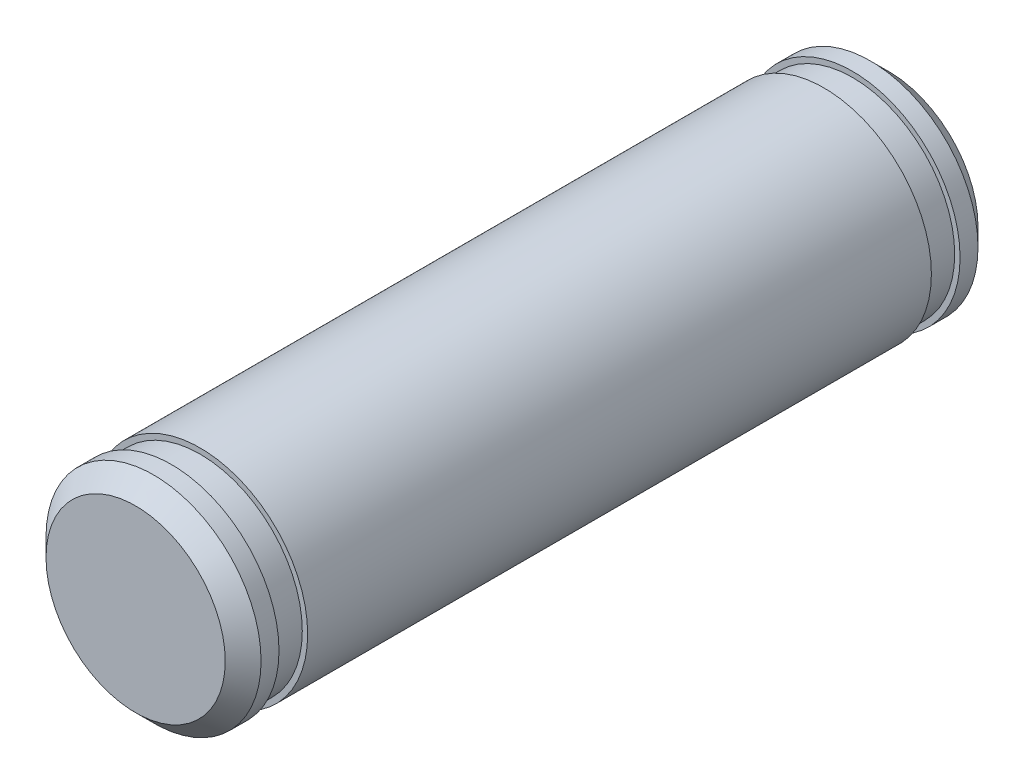
ISO-10303-21;
HEADER;
FILE_DESCRIPTION(('STEP AP214'),'2;1');
FILE_NAME('part.step','',(''),(''),'','','');
FILE_SCHEMA(('AUTOMOTIVE_DESIGN { 1 0 10303 214 1 1 1 1 }'));
ENDSEC;
DATA;
#1=APPLICATION_CONTEXT('core data for automotive mechanical design processes');
#2=APPLICATION_PROTOCOL_DEFINITION('international standard','automotive_design',2000,#1);
#3=PRODUCT_CONTEXT('',#1,'mechanical');
#4=PRODUCT('Part','Part','',(#3));
#5=PRODUCT_RELATED_PRODUCT_CATEGORY('part','',(#4));
#6=PRODUCT_DEFINITION_FORMATION('','',#4);
#7=PRODUCT_DEFINITION_CONTEXT('part definition',#1,'design');
#8=PRODUCT_DEFINITION('design','',#6,#7);
#9=PRODUCT_DEFINITION_SHAPE('','',#8);
#10=(LENGTH_UNIT() NAMED_UNIT(*) SI_UNIT(.MILLI.,.METRE.));
#11=(NAMED_UNIT(*) PLANE_ANGLE_UNIT() SI_UNIT($,.RADIAN.));
#12=(NAMED_UNIT(*) SI_UNIT($,.STERADIAN.) SOLID_ANGLE_UNIT());
#13=UNCERTAINTY_MEASURE_WITH_UNIT(LENGTH_MEASURE(1.E-05),#10,'distance_accuracy_value','');
#14=(GEOMETRIC_REPRESENTATION_CONTEXT(3) GLOBAL_UNCERTAINTY_ASSIGNED_CONTEXT((#13)) GLOBAL_UNIT_ASSIGNED_CONTEXT((#10,
#11,#12)) REPRESENTATION_CONTEXT('',''));
#15=CARTESIAN_POINT('',(0.,0.,0.));
#16=DIRECTION('',(0.,0.,1.));
#17=DIRECTION('',(1.,0.,0.));
#18=AXIS2_PLACEMENT_3D('',#15,#16,#17);
#19=CARTESIAN_POINT('',(0.,0.,21.));
#20=DIRECTION('',(0.,0.,-1.));
#21=DIRECTION('',(-1.,0.,0.));
#22=AXIS2_PLACEMENT_3D('',#19,#20,#21);
#23=CYLINDRICAL_SURFACE('',#22,3.);
#24=CARTESIAN_POINT('',(0.,0.,19.2));
#25=DIRECTION('',(0.,0.,1.));
#26=DIRECTION('',(1.,0.,0.));
#27=AXIS2_PLACEMENT_3D('',#24,#25,#26);
#28=CIRCLE('',#27,3.);
#29=CARTESIAN_POINT('',(-3.,0.,19.2));
#30=VERTEX_POINT('',#29);
#31=EDGE_CURVE('E68',#30,#30,#28,.T.);
#32=CARTESIAN_POINT('',(0.,0.,1.8));
#33=DIRECTION('',(0.,0.,-1.));
#34=DIRECTION('',(-1.,0.,0.));
#35=AXIS2_PLACEMENT_3D('',#32,#33,#34);
#36=CIRCLE('',#35,3.);
#37=CARTESIAN_POINT('',(-3.,0.,1.8));
#38=VERTEX_POINT('',#37);
#39=EDGE_CURVE('E81',#38,#38,#36,.T.);
#40=CARTESIAN_POINT('',(-3.,0.,19.2));
#41=CARTESIAN_POINT('',(-3.,0.,19.01875));
#42=CARTESIAN_POINT('',(-3.,0.,18.8375));
#43=CARTESIAN_POINT('',(-3.,0.,18.475));
#44=CARTESIAN_POINT('',(-3.,0.,18.29375));
#45=CARTESIAN_POINT('',(-3.,0.,17.93125));
#46=CARTESIAN_POINT('',(-3.,0.,17.75));
#47=CARTESIAN_POINT('',(-3.,0.,17.3875));
#48=CARTESIAN_POINT('',(-3.,0.,17.20625));
#49=CARTESIAN_POINT('',(-3.,0.,16.84375));
#50=CARTESIAN_POINT('',(-3.,0.,16.6625));
#51=CARTESIAN_POINT('',(-3.,0.,16.3));
#52=CARTESIAN_POINT('',(-3.,0.,16.11875));
#53=CARTESIAN_POINT('',(-3.,0.,15.75625));
#54=CARTESIAN_POINT('',(-3.,0.,15.575));
#55=CARTESIAN_POINT('',(-3.,0.,15.2125));
#56=CARTESIAN_POINT('',(-3.,0.,15.03125));
#57=CARTESIAN_POINT('',(-3.,0.,14.66875));
#58=CARTESIAN_POINT('',(-3.,0.,14.4875));
#59=CARTESIAN_POINT('',(-3.,0.,14.125));
#60=CARTESIAN_POINT('',(-3.,0.,13.94375));
#61=CARTESIAN_POINT('',(-3.,0.,13.58125));
#62=CARTESIAN_POINT('',(-3.,0.,13.4));
#63=CARTESIAN_POINT('',(-3.,0.,13.0375));
#64=CARTESIAN_POINT('',(-3.,0.,12.85625));
#65=CARTESIAN_POINT('',(-3.,0.,12.49375));
#66=CARTESIAN_POINT('',(-3.,0.,12.3125));
#67=CARTESIAN_POINT('',(-3.,0.,11.95));
#68=CARTESIAN_POINT('',(-3.,0.,11.76875));
#69=CARTESIAN_POINT('',(-3.,0.,11.40625));
#70=CARTESIAN_POINT('',(-3.,0.,11.225));
#71=CARTESIAN_POINT('',(-3.,0.,10.8625));
#72=CARTESIAN_POINT('',(-3.,0.,10.68125));
#73=CARTESIAN_POINT('',(-3.,0.,10.31875));
#74=CARTESIAN_POINT('',(-3.,0.,10.1375));
#75=CARTESIAN_POINT('',(-3.,0.,9.775));
#76=CARTESIAN_POINT('',(-3.,0.,9.59375));
#77=CARTESIAN_POINT('',(-3.,0.,9.23125));
#78=CARTESIAN_POINT('',(-3.,0.,9.05));
#79=CARTESIAN_POINT('',(-3.,0.,8.6875));
#80=CARTESIAN_POINT('',(-3.,0.,8.50625));
#81=CARTESIAN_POINT('',(-3.,0.,8.14375));
#82=CARTESIAN_POINT('',(-3.,0.,7.9625));
#83=CARTESIAN_POINT('',(-3.,0.,7.6));
#84=CARTESIAN_POINT('',(-3.,0.,7.41875));
#85=CARTESIAN_POINT('',(-3.,0.,7.05625));
#86=CARTESIAN_POINT('',(-3.,0.,6.875));
#87=CARTESIAN_POINT('',(-3.,0.,6.5125));
#88=CARTESIAN_POINT('',(-3.,0.,6.33125));
#89=CARTESIAN_POINT('',(-3.,0.,5.96875));
#90=CARTESIAN_POINT('',(-3.,0.,5.7875));
#91=CARTESIAN_POINT('',(-3.,0.,5.425));
#92=CARTESIAN_POINT('',(-3.,0.,5.24375));
#93=CARTESIAN_POINT('',(-3.,0.,4.88125));
#94=CARTESIAN_POINT('',(-3.,0.,4.7));
#95=CARTESIAN_POINT('',(-3.,0.,4.3375));
#96=CARTESIAN_POINT('',(-3.,0.,4.15625));
#97=CARTESIAN_POINT('',(-3.,0.,3.79375));
#98=CARTESIAN_POINT('',(-3.,0.,3.6125));
#99=CARTESIAN_POINT('',(-3.,0.,3.25));
#100=CARTESIAN_POINT('',(-3.,0.,3.06875));
#101=CARTESIAN_POINT('',(-3.,0.,2.70625));
#102=CARTESIAN_POINT('',(-3.,0.,2.525));
#103=CARTESIAN_POINT('',(-3.,0.,2.1625));
#104=CARTESIAN_POINT('',(-3.,0.,1.98125));
#105=CARTESIAN_POINT('',(-3.,0.,1.8));
#106=B_SPLINE_CURVE_WITH_KNOTS('',3,(#40,#41,#42,#43,#44,#45,#46,#47,#48,#49,#50,#51,#52,#53,
#54,#55,#56,#57,#58,#59,#60,#61,#62,#63,#64,#65,#66,#67,#68,#69,#70,#71,#72,#73,#74,#75,#76,#77,
#78,#79,#80,#81,#82,#83,#84,#85,#86,#87,#88,#89,#90,#91,#92,#93,#94,#95,#96,#97,#98,#99,#100,
#101,#102,#103,#104,#105),.UNSPECIFIED.,.F.,.F.,(4,2,2,2,2,2,2,2,2,2,2,2,2,2,2,2,2,2,2,2,2,2,2,
2,2,2,2,2,2,2,2,2,4),(0.,0.543749999999999,1.0875,1.63125,2.175,2.71875,3.2625,3.80625,4.35,
4.89375,5.4375,5.98125,6.525,7.06875,7.6125,8.15625,8.7,9.24375,9.7875,10.33125,10.875,11.41875,
11.9625,12.50625,13.05,13.59375,14.1375,14.68125,15.225,15.76875,16.3125,16.85625,17.4),.UNSPECIFIED.);
#107=EDGE_CURVE('BSEAM41',#30,#38,#106,.T.);
#108=ORIENTED_EDGE('',*,*,#31,.F.);
#109=ORIENTED_EDGE('',*,*,#39,.F.);
#110=ORIENTED_EDGE('',*,*,#107,.T.);
#111=ORIENTED_EDGE('',*,*,#107,.F.);
#112=EDGE_LOOP('',(#108,#110,#109,#111));
#113=FACE_BOUND('',#112,.T.);
#114=ADVANCED_FACE('F41',(#113),#23,.T.);
#115=CARTESIAN_POINT('',(0.,0.,19.2));
#116=DIRECTION('',(0.,0.,1.));
#117=DIRECTION('',(1.,0.,0.));
#118=AXIS2_PLACEMENT_3D('',#115,#116,#117);
#119=PLANE('',#118);
#120=CARTESIAN_POINT('',(0.,0.,19.2));
#121=DIRECTION('',(0.,0.,1.));
#122=DIRECTION('',(1.,0.,0.));
#123=AXIS2_PLACEMENT_3D('',#120,#121,#122);
#124=CIRCLE('',#123,2.85);
#125=CARTESIAN_POINT('',(2.85,0.,19.2));
#126=VERTEX_POINT('',#125);
#127=EDGE_CURVE('E73',#126,#126,#124,.T.);
#128=ORIENTED_EDGE('',*,*,#127,.F.);
#129=EDGE_LOOP('',(#128));
#130=FACE_BOUND('',#129,.T.);
#131=ORIENTED_EDGE('',*,*,#31,.T.);
#132=EDGE_LOOP('',(#131));
#133=FACE_BOUND('',#132,.T.);
#134=ADVANCED_FACE('F114',(#130,#133),#119,.T.);
#135=CARTESIAN_POINT('',(0.,0.,20.));
#136=DIRECTION('',(0.,0.,1.));
#137=DIRECTION('',(1.,0.,0.));
#138=AXIS2_PLACEMENT_3D('',#135,#136,#137);
#139=PLANE('',#138);
#140=CARTESIAN_POINT('',(0.,0.,20.));
#141=DIRECTION('',(0.,0.,1.));
#142=DIRECTION('',(1.,0.,0.));
#143=AXIS2_PLACEMENT_3D('',#140,#141,#142);
#144=CIRCLE('',#143,2.85);
#145=CARTESIAN_POINT('',(2.85,0.,20.));
#146=VERTEX_POINT('',#145);
#147=EDGE_CURVE('E77',#146,#146,#144,.T.);
#148=ORIENTED_EDGE('',*,*,#147,.T.);
#149=EDGE_LOOP('',(#148));
#150=FACE_BOUND('',#149,.T.);
#151=CARTESIAN_POINT('',(0.,0.,20.));
#152=DIRECTION('',(0.,0.,1.));
#153=DIRECTION('',(1.,0.,0.));
#154=AXIS2_PLACEMENT_3D('',#151,#152,#153);
#155=CIRCLE('',#154,3.);
#156=CARTESIAN_POINT('',(-3.,0.,20.));
#157=VERTEX_POINT('',#156);
#158=EDGE_CURVE('E69',#157,#157,#155,.T.);
#159=ORIENTED_EDGE('',*,*,#158,.F.);
#160=EDGE_LOOP('',(#159));
#161=FACE_BOUND('',#160,.T.);
#162=ADVANCED_FACE('F121',(#150,#161),#139,.F.);
#163=CARTESIAN_POINT('',(0.,0.,19.2));
#164=DIRECTION('',(0.,0.,1.));
#165=DIRECTION('',(1.,0.,0.));
#166=AXIS2_PLACEMENT_3D('',#163,#164,#165);
#167=CYLINDRICAL_SURFACE('',#166,2.85);
#168=ORIENTED_EDGE('',*,*,#127,.T.);
#169=EDGE_LOOP('',(#168));
#170=FACE_BOUND('',#169,.T.);
#171=ORIENTED_EDGE('',*,*,#147,.F.);
#172=EDGE_LOOP('',(#171));
#173=FACE_BOUND('',#172,.T.);
#174=ADVANCED_FACE('F142',(#170,#173),#167,.T.);
#175=CARTESIAN_POINT('',(0.,0.,21.));
#176=DIRECTION('',(0.,0.,1.));
#177=DIRECTION('',(1.,0.,0.));
#178=AXIS2_PLACEMENT_3D('',#175,#176,#177);
#179=PLANE('',#178);
#180=CARTESIAN_POINT('',(0.,0.,21.));
#181=DIRECTION('',(0.,0.,1.));
#182=DIRECTION('',(1.,0.,0.));
#183=AXIS2_PLACEMENT_3D('',#180,#181,#182);
#184=CIRCLE('',#183,2.50000000000001);
#185=CARTESIAN_POINT('',(2.50000000000001,0.,21.));
#186=VERTEX_POINT('',#185);
#187=EDGE_CURVE('E10',#186,#186,#184,.T.);
#188=ORIENTED_EDGE('',*,*,#187,.T.);
#189=EDGE_LOOP('',(#188));
#190=FACE_BOUND('',#189,.T.);
#191=ADVANCED_FACE('F134',(#190),#179,.T.);
#192=CARTESIAN_POINT('',(0.,0.,21.));
#193=DIRECTION('',(0.,0.,-1.));
#194=DIRECTION('',(-1.,0.,0.));
#195=AXIS2_PLACEMENT_3D('',#192,#193,#194);
#196=CONICAL_SURFACE('',#195,2.50000000000001,0.785398163397447);
#197=CARTESIAN_POINT('',(0.,0.,20.5));
#198=DIRECTION('',(0.,0.,1.));
#199=DIRECTION('',(1.,0.,0.));
#200=AXIS2_PLACEMENT_3D('',#197,#198,#199);
#201=CIRCLE('',#200,3.);
#202=CARTESIAN_POINT('',(-3.,0.,20.5));
#203=VERTEX_POINT('',#202);
#204=EDGE_CURVE('E62',#203,#203,#201,.F.);
#205=ORIENTED_EDGE('',*,*,#204,.F.);
#206=EDGE_LOOP('',(#205));
#207=FACE_BOUND('',#206,.T.);
#208=ORIENTED_EDGE('',*,*,#187,.F.);
#209=EDGE_LOOP('',(#208));
#210=FACE_BOUND('',#209,.T.);
#211=ADVANCED_FACE('F44',(#207,#210),#196,.T.);
#212=CARTESIAN_POINT('',(-3.,0.,20.));
#213=CARTESIAN_POINT('',(-3.,0.,20.0052083333333));
#214=CARTESIAN_POINT('',(-3.,0.,20.0104166666667));
#215=CARTESIAN_POINT('',(-3.,0.,20.0208333333333));
#216=CARTESIAN_POINT('',(-3.,0.,20.0260416666667));
#217=CARTESIAN_POINT('',(-3.,0.,20.0364583333333));
#218=CARTESIAN_POINT('',(-3.,0.,20.0416666666667));
#219=CARTESIAN_POINT('',(-3.,0.,20.0520833333333));
#220=CARTESIAN_POINT('',(-3.,0.,20.0572916666667));
#221=CARTESIAN_POINT('',(-3.,0.,20.0677083333333));
#222=CARTESIAN_POINT('',(-3.,0.,20.0729166666667));
#223=CARTESIAN_POINT('',(-3.,0.,20.0833333333333));
#224=CARTESIAN_POINT('',(-3.,0.,20.0885416666667));
#225=CARTESIAN_POINT('',(-3.,0.,20.0989583333333));
#226=CARTESIAN_POINT('',(-3.,0.,20.1041666666667));
#227=CARTESIAN_POINT('',(-3.,0.,20.1145833333333));
#228=CARTESIAN_POINT('',(-3.,0.,20.1197916666667));
#229=CARTESIAN_POINT('',(-3.,0.,20.1302083333333));
#230=CARTESIAN_POINT('',(-3.,0.,20.1354166666667));
#231=CARTESIAN_POINT('',(-3.,0.,20.1458333333333));
#232=CARTESIAN_POINT('',(-3.,0.,20.1510416666667));
#233=CARTESIAN_POINT('',(-3.,0.,20.1614583333333));
#234=CARTESIAN_POINT('',(-3.,0.,20.1666666666667));
#235=CARTESIAN_POINT('',(-3.,0.,20.1770833333333));
#236=CARTESIAN_POINT('',(-3.,0.,20.1822916666667));
#237=CARTESIAN_POINT('',(-3.,0.,20.1927083333333));
#238=CARTESIAN_POINT('',(-3.,0.,20.1979166666667));
#239=CARTESIAN_POINT('',(-3.,0.,20.2083333333333));
#240=CARTESIAN_POINT('',(-3.,0.,20.2135416666667));
#241=CARTESIAN_POINT('',(-3.,0.,20.2239583333333));
#242=CARTESIAN_POINT('',(-3.,0.,20.2291666666667));
#243=CARTESIAN_POINT('',(-3.,0.,20.2395833333333));
#244=CARTESIAN_POINT('',(-3.,0.,20.2447916666667));
#245=CARTESIAN_POINT('',(-3.,0.,20.2552083333333));
#246=CARTESIAN_POINT('',(-3.,0.,20.2604166666667));
#247=CARTESIAN_POINT('',(-3.,0.,20.2708333333333));
#248=CARTESIAN_POINT('',(-3.,0.,20.2760416666667));
#249=CARTESIAN_POINT('',(-3.,0.,20.2864583333333));
#250=CARTESIAN_POINT('',(-3.,0.,20.2916666666667));
#251=CARTESIAN_POINT('',(-3.,0.,20.3020833333333));
#252=CARTESIAN_POINT('',(-3.,0.,20.3072916666667));
#253=CARTESIAN_POINT('',(-3.,0.,20.3177083333333));
#254=CARTESIAN_POINT('',(-3.,0.,20.3229166666667));
#255=CARTESIAN_POINT('',(-3.,0.,20.3333333333333));
#256=CARTESIAN_POINT('',(-3.,0.,20.3385416666667));
#257=CARTESIAN_POINT('',(-3.,0.,20.3489583333333));
#258=CARTESIAN_POINT('',(-3.,0.,20.3541666666667));
#259=CARTESIAN_POINT('',(-3.,0.,20.3645833333333));
#260=CARTESIAN_POINT('',(-3.,0.,20.3697916666667));
#261=CARTESIAN_POINT('',(-3.,0.,20.3802083333333));
#262=CARTESIAN_POINT('',(-3.,0.,20.3854166666667));
#263=CARTESIAN_POINT('',(-3.,0.,20.3958333333333));
#264=CARTESIAN_POINT('',(-3.,0.,20.4010416666667));
#265=CARTESIAN_POINT('',(-3.,0.,20.4114583333333));
#266=CARTESIAN_POINT('',(-3.,0.,20.4166666666667));
#267=CARTESIAN_POINT('',(-3.,0.,20.4270833333333));
#268=CARTESIAN_POINT('',(-3.,0.,20.4322916666667));
#269=CARTESIAN_POINT('',(-3.,0.,20.4427083333333));
#270=CARTESIAN_POINT('',(-3.,0.,20.4479166666667));
#271=CARTESIAN_POINT('',(-3.,0.,20.4583333333333));
#272=CARTESIAN_POINT('',(-3.,0.,20.4635416666667));
#273=CARTESIAN_POINT('',(-3.,0.,20.4739583333333));
#274=CARTESIAN_POINT('',(-3.,0.,20.4791666666667));
#275=CARTESIAN_POINT('',(-3.,0.,20.4895833333333));
#276=CARTESIAN_POINT('',(-3.,0.,20.4947916666667));
#277=CARTESIAN_POINT('',(-3.,0.,20.5));
#278=B_SPLINE_CURVE_WITH_KNOTS('',3,(#212,#213,#214,#215,#216,#217,#218,#219,#220,#221,#222,
#223,#224,#225,#226,#227,#228,#229,#230,#231,#232,#233,#234,#235,#236,#237,#238,#239,#240,#241,
#242,#243,#244,#245,#246,#247,#248,#249,#250,#251,#252,#253,#254,#255,#256,#257,#258,#259,#260,
#261,#262,#263,#264,#265,#266,#267,#268,#269,#270,#271,#272,#273,#274,#275,#276,#277),
.UNSPECIFIED.,.F.,.F.,(4,2,2,2,2,2,2,2,2,2,2,2,2,2,2,2,2,2,2,2,2,2,2,2,2,2,2,2,2,2,2,2,4),(0.,
0.0156249999999983,0.03125,0.0468749999999983,0.0625000000000001,0.0781250000000018,
0.0937500000000001,0.109375000000002,0.125,0.140625000000002,0.15625,0.171875000000002,
0.187500000000004,0.203125000000002,0.218750000000004,0.234375000000002,0.250000000000004,
0.265625000000005,0.281250000000004,0.296875000000005,0.312500000000004,0.328125000000005,
0.343750000000007,0.359375000000006,0.375000000000007,0.390625000000006,0.406250000000007,
0.421875000000009,0.437500000000007,0.453125000000009,0.468750000000007,0.484375000000009,
0.500000000000007),.UNSPECIFIED.);
#279=EDGE_CURVE('BSEAM109',#157,#203,#278,.T.);
#280=ORIENTED_EDGE('',*,*,#158,.T.);
#281=ORIENTED_EDGE('',*,*,#204,.T.);
#282=ORIENTED_EDGE('',*,*,#279,.T.);
#283=ORIENTED_EDGE('',*,*,#279,.F.);
#284=EDGE_LOOP('',(#280,#282,#281,#283));
#285=FACE_BOUND('',#284,.T.);
#286=ADVANCED_FACE('F109',(#285),#23,.T.);
#287=CARTESIAN_POINT('',(0.,0.,1.8));
#288=DIRECTION('',(0.,0.,-1.));
#289=DIRECTION('',(-1.,0.,0.));
#290=AXIS2_PLACEMENT_3D('',#287,#288,#289);
#291=PLANE('',#290);
#292=CARTESIAN_POINT('',(0.,0.,1.8));
#293=DIRECTION('',(0.,0.,-1.));
#294=DIRECTION('',(-1.,0.,0.));
#295=AXIS2_PLACEMENT_3D('',#292,#293,#294);
#296=CIRCLE('',#295,2.85);
#297=CARTESIAN_POINT('',(-2.85,0.,1.8));
#298=VERTEX_POINT('',#297);
#299=EDGE_CURVE('E89',#298,#298,#296,.T.);
#300=ORIENTED_EDGE('',*,*,#299,.F.);
#301=EDGE_LOOP('',(#300));
#302=FACE_BOUND('',#301,.T.);
#303=ORIENTED_EDGE('',*,*,#39,.T.);
#304=EDGE_LOOP('',(#303));
#305=FACE_BOUND('',#304,.T.);
#306=ADVANCED_FACE('F105',(#302,#305),#291,.T.);
#307=CARTESIAN_POINT('',(0.,0.,1.));
#308=DIRECTION('',(0.,0.,-1.));
#309=DIRECTION('',(-1.,0.,0.));
#310=AXIS2_PLACEMENT_3D('',#307,#308,#309);
#311=PLANE('',#310);
#312=CARTESIAN_POINT('',(0.,0.,1.));
#313=DIRECTION('',(0.,0.,-1.));
#314=DIRECTION('',(-1.,0.,0.));
#315=AXIS2_PLACEMENT_3D('',#312,#313,#314);
#316=CIRCLE('',#315,2.85);
#317=CARTESIAN_POINT('',(-2.85,0.,1.));
#318=VERTEX_POINT('',#317);
#319=EDGE_CURVE('E93',#318,#318,#316,.T.);
#320=ORIENTED_EDGE('',*,*,#319,.T.);
#321=EDGE_LOOP('',(#320));
#322=FACE_BOUND('',#321,.T.);
#323=CARTESIAN_POINT('',(0.,0.,1.));
#324=DIRECTION('',(0.,0.,-1.));
#325=DIRECTION('',(-1.,0.,0.));
#326=AXIS2_PLACEMENT_3D('',#323,#324,#325);
#327=CIRCLE('',#326,3.);
#328=CARTESIAN_POINT('',(-3.,0.,1.));
#329=VERTEX_POINT('',#328);
#330=EDGE_CURVE('E85',#329,#329,#327,.T.);
#331=ORIENTED_EDGE('',*,*,#330,.F.);
#332=EDGE_LOOP('',(#331));
#333=FACE_BOUND('',#332,.T.);
#334=ADVANCED_FACE('F108',(#322,#333),#311,.F.);
#335=CARTESIAN_POINT('',(0.,0.,1.8));
#336=DIRECTION('',(0.,0.,-1.));
#337=DIRECTION('',(-1.,0.,0.));
#338=AXIS2_PLACEMENT_3D('',#335,#336,#337);
#339=CYLINDRICAL_SURFACE('',#338,2.85);
#340=ORIENTED_EDGE('',*,*,#299,.T.);
#341=EDGE_LOOP('',(#340));
#342=FACE_BOUND('',#341,.T.);
#343=ORIENTED_EDGE('',*,*,#319,.F.);
#344=EDGE_LOOP('',(#343));
#345=FACE_BOUND('',#344,.T.);
#346=ADVANCED_FACE('F102',(#342,#345),#339,.T.);
#347=CARTESIAN_POINT('',(0.,0.,0.));
#348=DIRECTION('',(0.,0.,1.));
#349=DIRECTION('',(1.,0.,0.));
#350=AXIS2_PLACEMENT_3D('',#347,#348,#349);
#351=PLANE('',#350);
#352=CARTESIAN_POINT('',(0.,0.,0.));
#353=DIRECTION('',(0.,0.,1.));
#354=DIRECTION('',(1.,0.,0.));
#355=AXIS2_PLACEMENT_3D('',#352,#353,#354);
#356=CIRCLE('',#355,2.49999999999998);
#357=CARTESIAN_POINT('',(2.49999999999998,0.,0.));
#358=VERTEX_POINT('',#357);
#359=EDGE_CURVE('E50',#358,#358,#356,.F.);
#360=ORIENTED_EDGE('',*,*,#359,.T.);
#361=EDGE_LOOP('',(#360));
#362=FACE_BOUND('',#361,.T.);
#363=ADVANCED_FACE('F152',(#362),#351,.F.);
#364=CARTESIAN_POINT('',(0.,0.,0.500000000000014));
#365=DIRECTION('',(0.,0.,1.));
#366=DIRECTION('',(1.,0.,0.));
#367=AXIS2_PLACEMENT_3D('',#364,#365,#366);
#368=CONICAL_SURFACE('',#367,3.,0.78539816339745);
#369=ORIENTED_EDGE('',*,*,#359,.F.);
#370=EDGE_LOOP('',(#369));
#371=FACE_BOUND('',#370,.T.);
#372=CARTESIAN_POINT('',(0.,0.,0.500000000000014));
#373=DIRECTION('',(0.,0.,1.));
#374=DIRECTION('',(1.,0.,0.));
#375=AXIS2_PLACEMENT_3D('',#372,#373,#374);
#376=CIRCLE('',#375,3.);
#377=CARTESIAN_POINT('',(-3.,0.,0.500000000000014));
#378=VERTEX_POINT('',#377);
#379=EDGE_CURVE('E56',#378,#378,#376,.T.);
#380=ORIENTED_EDGE('',*,*,#379,.F.);
#381=EDGE_LOOP('',(#380));
#382=FACE_BOUND('',#381,.T.);
#383=ADVANCED_FACE('F127',(#371,#382),#368,.T.);
#384=CARTESIAN_POINT('',(-3.,0.,1.));
#385=CARTESIAN_POINT('',(-3.,0.,0.994791666666668));
#386=CARTESIAN_POINT('',(-3.,0.,0.989583333333335));
#387=CARTESIAN_POINT('',(-3.,0.,0.979166666666669));
#388=CARTESIAN_POINT('',(-3.,0.,0.973958333333335));
#389=CARTESIAN_POINT('',(-3.,0.,0.963541666666668));
#390=CARTESIAN_POINT('',(-3.,0.,0.958333333333335));
#391=CARTESIAN_POINT('',(-3.,0.,0.947916666666669));
#392=CARTESIAN_POINT('',(-3.,0.,0.942708333333335));
#393=CARTESIAN_POINT('',(-3.,0.,0.932291666666668));
#394=CARTESIAN_POINT('',(-3.,0.,0.927083333333335));
#395=CARTESIAN_POINT('',(-3.,0.,0.91666666666667));
#396=CARTESIAN_POINT('',(-3.,0.,0.911458333333337));
#397=CARTESIAN_POINT('',(-3.,0.,0.90104166666667));
#398=CARTESIAN_POINT('',(-3.,0.,0.895833333333336));
#399=CARTESIAN_POINT('',(-3.,0.,0.88541666666667));
#400=CARTESIAN_POINT('',(-3.,0.,0.880208333333337));
#401=CARTESIAN_POINT('',(-3.,0.,0.869791666666672));
#402=CARTESIAN_POINT('',(-3.,0.,0.864583333333339));
#403=CARTESIAN_POINT('',(-3.,0.,0.854166666666672));
#404=CARTESIAN_POINT('',(-3.,0.,0.848958333333338));
#405=CARTESIAN_POINT('',(-3.,0.,0.838541666666671));
#406=CARTESIAN_POINT('',(-3.,0.,0.833333333333339));
#407=CARTESIAN_POINT('',(-3.,0.,0.822916666666673));
#408=CARTESIAN_POINT('',(-3.,0.,0.81770833333334));
#409=CARTESIAN_POINT('',(-3.,0.,0.807291666666674));
#410=CARTESIAN_POINT('',(-3.,0.,0.80208333333334));
#411=CARTESIAN_POINT('',(-3.,0.,0.791666666666673));
#412=CARTESIAN_POINT('',(-3.,0.,0.78645833333334));
#413=CARTESIAN_POINT('',(-3.,0.,0.776041666666674));
#414=CARTESIAN_POINT('',(-3.,0.,0.77083333333334));
#415=CARTESIAN_POINT('',(-3.,0.,0.760416666666673));
#416=CARTESIAN_POINT('',(-3.,0.,0.75520833333334));
#417=CARTESIAN_POINT('',(-3.,0.,0.744791666666675));
#418=CARTESIAN_POINT('',(-3.,0.,0.739583333333342));
#419=CARTESIAN_POINT('',(-3.,0.,0.729166666666675));
#420=CARTESIAN_POINT('',(-3.,0.,0.723958333333341));
#421=CARTESIAN_POINT('',(-3.,0.,0.713541666666675));
#422=CARTESIAN_POINT('',(-3.,0.,0.708333333333342));
#423=CARTESIAN_POINT('',(-3.,0.,0.697916666666675));
#424=CARTESIAN_POINT('',(-3.,0.,0.692708333333341));
#425=CARTESIAN_POINT('',(-3.,0.,0.682291666666675));
#426=CARTESIAN_POINT('',(-3.,0.,0.677083333333342));
#427=CARTESIAN_POINT('',(-3.,0.,0.666666666666677));
#428=CARTESIAN_POINT('',(-3.,0.,0.661458333333344));
#429=CARTESIAN_POINT('',(-3.,0.,0.651041666666677));
#430=CARTESIAN_POINT('',(-3.,0.,0.645833333333343));
#431=CARTESIAN_POINT('',(-3.,0.,0.635416666666677));
#432=CARTESIAN_POINT('',(-3.,0.,0.630208333333344));
#433=CARTESIAN_POINT('',(-3.,0.,0.619791666666678));
#434=CARTESIAN_POINT('',(-3.,0.,0.614583333333345));
#435=CARTESIAN_POINT('',(-3.,0.,0.604166666666679));
#436=CARTESIAN_POINT('',(-3.,0.,0.598958333333345));
#437=CARTESIAN_POINT('',(-3.,0.,0.588541666666678));
#438=CARTESIAN_POINT('',(-3.,0.,0.583333333333345));
#439=CARTESIAN_POINT('',(-3.,0.,0.57291666666668));
#440=CARTESIAN_POINT('',(-3.,0.,0.567708333333347));
#441=CARTESIAN_POINT('',(-3.,0.,0.55729166666668));
#442=CARTESIAN_POINT('',(-3.,0.,0.552083333333347));
#443=CARTESIAN_POINT('',(-3.,0.,0.54166666666668));
#444=CARTESIAN_POINT('',(-3.,0.,0.536458333333347));
#445=CARTESIAN_POINT('',(-3.,0.,0.52604166666668));
#446=CARTESIAN_POINT('',(-3.,0.,0.520833333333347));
#447=CARTESIAN_POINT('',(-3.,0.,0.51041666666668));
#448=CARTESIAN_POINT('',(-3.,0.,0.505208333333347));
#449=CARTESIAN_POINT('',(-3.,0.,0.500000000000014));
#450=B_SPLINE_CURVE_WITH_KNOTS('',3,(#384,#385,#386,#387,#388,#389,#390,#391,#392,#393,#394,
#395,#396,#397,#398,#399,#400,#401,#402,#403,#404,#405,#406,#407,#408,#409,#410,#411,#412,#413,
#414,#415,#416,#417,#418,#419,#420,#421,#422,#423,#424,#425,#426,#427,#428,#429,#430,#431,#432,
#433,#434,#435,#436,#437,#438,#439,#440,#441,#442,#443,#444,#445,#446,#447,#448,#449),
.UNSPECIFIED.,.F.,.F.,(4,2,2,2,2,2,2,2,2,2,2,2,2,2,2,2,2,2,2,2,2,2,2,2,2,2,2,2,2,2,2,2,4),(0.,
0.0156249999999983,0.03125,0.0468749999999983,0.0625000000000001,0.0781249999999983,
0.0937499999999966,0.109374999999998,0.124999999999997,0.140624999999995,0.156249999999997,
0.171874999999995,0.187499999999993,0.203124999999995,0.218749999999993,0.234374999999995,
0.249999999999993,0.265624999999992,0.281249999999993,0.296874999999992,0.312499999999993,
0.328124999999992,0.34374999999999,0.359374999999992,0.37499999999999,0.390624999999988,
0.40624999999999,0.421874999999988,0.437499999999987,0.453124999999988,0.468749999999987,
0.484374999999988,0.499999999999987),.UNSPECIFIED.);
#451=EDGE_CURVE('BSEAM117',#329,#378,#450,.T.);
#452=ORIENTED_EDGE('',*,*,#330,.T.);
#453=ORIENTED_EDGE('',*,*,#379,.T.);
#454=ORIENTED_EDGE('',*,*,#451,.T.);
#455=ORIENTED_EDGE('',*,*,#451,.F.);
#456=EDGE_LOOP('',(#452,#454,#453,#455));
#457=FACE_BOUND('',#456,.T.);
#458=ADVANCED_FACE('F117',(#457),#23,.T.);
#459=CLOSED_SHELL('',(#114,#134,#162,#174,#191,#211,#286,#306,#334,#346,#363,#383,#458));
#460=MANIFOLD_SOLID_BREP('B2',#459);
#461=ADVANCED_BREP_SHAPE_REPRESENTATION('',(#18,#460),#14);
#462=SHAPE_DEFINITION_REPRESENTATION(#9,#461);
ENDSEC;
END-ISO-10303-21;
